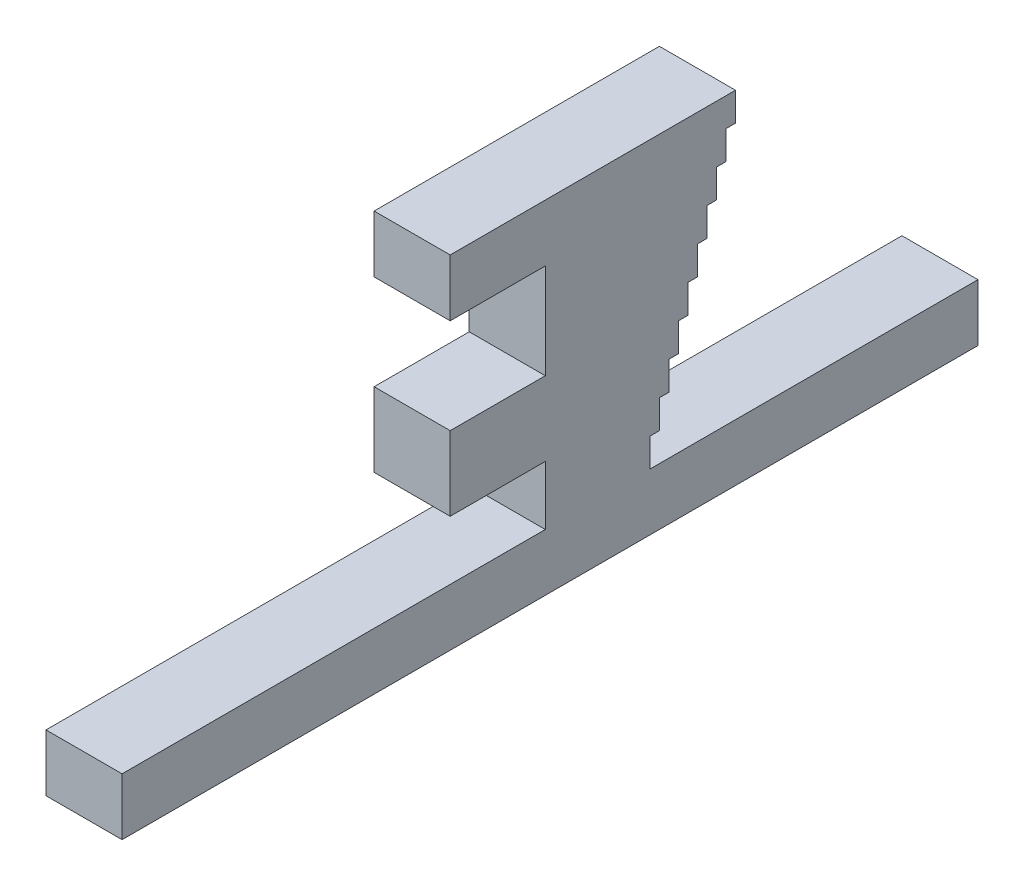
ISO-10303-21;
HEADER;
FILE_DESCRIPTION(('STEP AP214'),'2;1');
FILE_NAME('part.step','',(''),(''),'','','');
FILE_SCHEMA(('AUTOMOTIVE_DESIGN { 1 0 10303 214 1 1 1 1 }'));
ENDSEC;
DATA;
#1=APPLICATION_CONTEXT('core data for automotive mechanical design processes');
#2=APPLICATION_PROTOCOL_DEFINITION('international standard','automotive_design',2000,#1);
#3=PRODUCT_CONTEXT('',#1,'mechanical');
#4=PRODUCT('Part','Part','',(#3));
#5=PRODUCT_RELATED_PRODUCT_CATEGORY('part','',(#4));
#6=PRODUCT_DEFINITION_FORMATION('','',#4);
#7=PRODUCT_DEFINITION_CONTEXT('part definition',#1,'design');
#8=PRODUCT_DEFINITION('design','',#6,#7);
#9=PRODUCT_DEFINITION_SHAPE('','',#8);
#10=(LENGTH_UNIT() NAMED_UNIT(*) SI_UNIT(.MILLI.,.METRE.));
#11=(NAMED_UNIT(*) PLANE_ANGLE_UNIT() SI_UNIT($,.RADIAN.));
#12=(NAMED_UNIT(*) SI_UNIT($,.STERADIAN.) SOLID_ANGLE_UNIT());
#13=UNCERTAINTY_MEASURE_WITH_UNIT(LENGTH_MEASURE(1.E-05),#10,'distance_accuracy_value','');
#14=(GEOMETRIC_REPRESENTATION_CONTEXT(3) GLOBAL_UNCERTAINTY_ASSIGNED_CONTEXT((#13)) GLOBAL_UNIT_ASSIGNED_CONTEXT((#10,
#11,#12)) REPRESENTATION_CONTEXT('',''));
#15=CARTESIAN_POINT('',(0.,0.,0.));
#16=DIRECTION('',(0.,0.,1.));
#17=DIRECTION('',(1.,0.,0.));
#18=AXIS2_PLACEMENT_3D('',#15,#16,#17);
#19=CARTESIAN_POINT('',(4.,1.5,3.99999999999996));
#20=DIRECTION('',(0.,0.,1.));
#21=DIRECTION('',(0.,-1.,0.));
#22=AXIS2_PLACEMENT_3D('',#19,#20,#21);
#23=PLANE('',#22);
#24=DIRECTION('',(0.,1.,0.));
#25=VECTOR('',#24,1.);
#26=CARTESIAN_POINT('',(0.,1.5,3.99999999999996));
#27=LINE('',#26,#25);
#28=CARTESIAN_POINT('',(0.,0.,3.99999999999996));
#29=VERTEX_POINT('',#28);
#30=CARTESIAN_POINT('',(0.,1.5,3.99999999999996));
#31=VERTEX_POINT('',#30);
#32=EDGE_CURVE('E274',#29,#31,#27,.T.);
#33=ORIENTED_EDGE('',*,*,#32,.T.);
#34=DIRECTION('',(-1.,0.,0.));
#35=VECTOR('',#34,1.);
#36=CARTESIAN_POINT('',(4.,1.5,3.99999999999996));
#37=LINE('',#36,#35);
#38=CARTESIAN_POINT('',(4.,1.5,3.99999999999996));
#39=VERTEX_POINT('',#38);
#40=EDGE_CURVE('E11',#39,#31,#37,.T.);
#41=ORIENTED_EDGE('',*,*,#40,.F.);
#42=DIRECTION('',(0.,1.,0.));
#43=VECTOR('',#42,1.);
#44=CARTESIAN_POINT('',(4.,1.5,3.99999999999996));
#45=LINE('',#44,#43);
#46=CARTESIAN_POINT('',(4.,0.,3.99999999999996));
#47=VERTEX_POINT('',#46);
#48=EDGE_CURVE('E337',#47,#39,#45,.T.);
#49=ORIENTED_EDGE('',*,*,#48,.F.);
#50=DIRECTION('',(-1.,0.,0.));
#51=VECTOR('',#50,1.);
#52=CARTESIAN_POINT('',(4.,0.,3.99999999999996));
#53=LINE('',#52,#51);
#54=EDGE_CURVE('E270',#47,#29,#53,.T.);
#55=ORIENTED_EDGE('',*,*,#54,.T.);
#56=EDGE_LOOP('',(#33,#41,#49,#55));
#57=FACE_BOUND('',#56,.T.);
#58=ADVANCED_FACE('F34',(#57),#23,.F.);
#59=CARTESIAN_POINT('',(4.,1.5,3.49999999999996));
#60=DIRECTION('',(0.,1.,0.));
#61=DIRECTION('',(0.,0.,1.));
#62=AXIS2_PLACEMENT_3D('',#59,#60,#61);
#63=PLANE('',#62);
#64=DIRECTION('',(0.,0.,-1.));
#65=VECTOR('',#64,1.);
#66=CARTESIAN_POINT('',(0.,1.5,3.49999999999996));
#67=LINE('',#66,#65);
#68=CARTESIAN_POINT('',(0.,1.5,3.49999999999996));
#69=VERTEX_POINT('',#68);
#70=EDGE_CURVE('E277',#31,#69,#67,.T.);
#71=ORIENTED_EDGE('',*,*,#70,.T.);
#72=DIRECTION('',(-1.,0.,0.));
#73=VECTOR('',#72,1.);
#74=CARTESIAN_POINT('',(4.,1.5,3.49999999999996));
#75=LINE('',#74,#73);
#76=CARTESIAN_POINT('',(4.,1.5,3.49999999999996));
#77=VERTEX_POINT('',#76);
#78=EDGE_CURVE('E42',#77,#69,#75,.T.);
#79=ORIENTED_EDGE('',*,*,#78,.F.);
#80=DIRECTION('',(0.,0.,-1.));
#81=VECTOR('',#80,1.);
#82=CARTESIAN_POINT('',(4.,1.5,3.49999999999996));
#83=LINE('',#82,#81);
#84=EDGE_CURVE('E165',#39,#77,#83,.T.);
#85=ORIENTED_EDGE('',*,*,#84,.F.);
#86=ORIENTED_EDGE('',*,*,#40,.T.);
#87=EDGE_LOOP('',(#71,#79,#85,#86));
#88=FACE_BOUND('',#87,.T.);
#89=ADVANCED_FACE('F514',(#88),#63,.F.);
#90=CARTESIAN_POINT('',(4.,3.,3.49999999999995));
#91=DIRECTION('',(0.,0.,1.));
#92=DIRECTION('',(0.,-1.,0.));
#93=AXIS2_PLACEMENT_3D('',#90,#91,#92);
#94=PLANE('',#93);
#95=DIRECTION('',(0.,1.,0.));
#96=VECTOR('',#95,1.);
#97=CARTESIAN_POINT('',(0.,3.,3.49999999999995));
#98=LINE('',#97,#96);
#99=CARTESIAN_POINT('',(0.,3.,3.49999999999995));
#100=VERTEX_POINT('',#99);
#101=EDGE_CURVE('E279',#69,#100,#98,.T.);
#102=ORIENTED_EDGE('',*,*,#101,.T.);
#103=DIRECTION('',(-1.,0.,0.));
#104=VECTOR('',#103,1.);
#105=CARTESIAN_POINT('',(4.,3.,3.49999999999995));
#106=LINE('',#105,#104);
#107=CARTESIAN_POINT('',(4.,3.,3.49999999999995));
#108=VERTEX_POINT('',#107);
#109=EDGE_CURVE('E416',#108,#100,#106,.T.);
#110=ORIENTED_EDGE('',*,*,#109,.F.);
#111=DIRECTION('',(0.,1.,0.));
#112=VECTOR('',#111,1.);
#113=CARTESIAN_POINT('',(4.,3.,3.49999999999995));
#114=LINE('',#113,#112);
#115=EDGE_CURVE('E424',#77,#108,#114,.T.);
#116=ORIENTED_EDGE('',*,*,#115,.F.);
#117=ORIENTED_EDGE('',*,*,#78,.T.);
#118=EDGE_LOOP('',(#102,#110,#116,#117));
#119=FACE_BOUND('',#118,.T.);
#120=ADVANCED_FACE('F422',(#119),#94,.F.);
#121=CARTESIAN_POINT('',(4.,3.,2.99999999999996));
#122=DIRECTION('',(0.,1.,0.));
#123=DIRECTION('',(0.,0.,1.));
#124=AXIS2_PLACEMENT_3D('',#121,#122,#123);
#125=PLANE('',#124);
#126=DIRECTION('',(0.,0.,-1.));
#127=VECTOR('',#126,1.);
#128=CARTESIAN_POINT('',(0.,3.,2.99999999999996));
#129=LINE('',#128,#127);
#130=CARTESIAN_POINT('',(0.,3.,2.99999999999996));
#131=VERTEX_POINT('',#130);
#132=EDGE_CURVE('E281',#100,#131,#129,.T.);
#133=ORIENTED_EDGE('',*,*,#132,.T.);
#134=DIRECTION('',(-1.,0.,0.));
#135=VECTOR('',#134,1.);
#136=CARTESIAN_POINT('',(4.,3.,2.99999999999996));
#137=LINE('',#136,#135);
#138=CARTESIAN_POINT('',(4.,3.,2.99999999999996));
#139=VERTEX_POINT('',#138);
#140=EDGE_CURVE('E413',#139,#131,#137,.T.);
#141=ORIENTED_EDGE('',*,*,#140,.F.);
#142=DIRECTION('',(0.,0.,-1.));
#143=VECTOR('',#142,1.);
#144=CARTESIAN_POINT('',(4.,3.,2.99999999999996));
#145=LINE('',#144,#143);
#146=EDGE_CURVE('E442',#108,#139,#145,.T.);
#147=ORIENTED_EDGE('',*,*,#146,.F.);
#148=ORIENTED_EDGE('',*,*,#109,.T.);
#149=EDGE_LOOP('',(#133,#141,#147,#148));
#150=FACE_BOUND('',#149,.T.);
#151=ADVANCED_FACE('F433',(#150),#125,.F.);
#152=CARTESIAN_POINT('',(4.,4.5,2.99999999999996));
#153=DIRECTION('',(0.,0.,1.));
#154=DIRECTION('',(0.,-1.,0.));
#155=AXIS2_PLACEMENT_3D('',#152,#153,#154);
#156=PLANE('',#155);
#157=DIRECTION('',(0.,1.,0.));
#158=VECTOR('',#157,1.);
#159=CARTESIAN_POINT('',(0.,4.5,2.99999999999996));
#160=LINE('',#159,#158);
#161=CARTESIAN_POINT('',(0.,4.5,2.99999999999996));
#162=VERTEX_POINT('',#161);
#163=EDGE_CURVE('E283',#131,#162,#160,.T.);
#164=ORIENTED_EDGE('',*,*,#163,.T.);
#165=DIRECTION('',(-1.,0.,0.));
#166=VECTOR('',#165,1.);
#167=CARTESIAN_POINT('',(4.,4.5,2.99999999999996));
#168=LINE('',#167,#166);
#169=CARTESIAN_POINT('',(4.,4.5,2.99999999999996));
#170=VERTEX_POINT('',#169);
#171=EDGE_CURVE('E410',#170,#162,#168,.T.);
#172=ORIENTED_EDGE('',*,*,#171,.F.);
#173=DIRECTION('',(0.,1.,0.));
#174=VECTOR('',#173,1.);
#175=CARTESIAN_POINT('',(4.,4.5,2.99999999999996));
#176=LINE('',#175,#174);
#177=EDGE_CURVE('E439',#139,#170,#176,.T.);
#178=ORIENTED_EDGE('',*,*,#177,.F.);
#179=ORIENTED_EDGE('',*,*,#140,.T.);
#180=EDGE_LOOP('',(#164,#172,#178,#179));
#181=FACE_BOUND('',#180,.T.);
#182=ADVANCED_FACE('F437',(#181),#156,.F.);
#183=CARTESIAN_POINT('',(4.,4.5,2.49999999999998));
#184=DIRECTION('',(0.,1.,0.));
#185=DIRECTION('',(0.,0.,1.));
#186=AXIS2_PLACEMENT_3D('',#183,#184,#185);
#187=PLANE('',#186);
#188=DIRECTION('',(0.,0.,-1.));
#189=VECTOR('',#188,1.);
#190=CARTESIAN_POINT('',(0.,4.5,2.49999999999998));
#191=LINE('',#190,#189);
#192=CARTESIAN_POINT('',(0.,4.5,2.49999999999998));
#193=VERTEX_POINT('',#192);
#194=EDGE_CURVE('E285',#162,#193,#191,.T.);
#195=ORIENTED_EDGE('',*,*,#194,.T.);
#196=DIRECTION('',(-1.,0.,0.));
#197=VECTOR('',#196,1.);
#198=CARTESIAN_POINT('',(4.,4.5,2.49999999999998));
#199=LINE('',#198,#197);
#200=CARTESIAN_POINT('',(4.,4.5,2.49999999999998));
#201=VERTEX_POINT('',#200);
#202=EDGE_CURVE('E407',#201,#193,#199,.T.);
#203=ORIENTED_EDGE('',*,*,#202,.F.);
#204=DIRECTION('',(0.,0.,-1.));
#205=VECTOR('',#204,1.);
#206=CARTESIAN_POINT('',(4.,4.5,2.49999999999998));
#207=LINE('',#206,#205);
#208=EDGE_CURVE('E441',#170,#201,#207,.T.);
#209=ORIENTED_EDGE('',*,*,#208,.F.);
#210=ORIENTED_EDGE('',*,*,#171,.T.);
#211=EDGE_LOOP('',(#195,#203,#209,#210));
#212=FACE_BOUND('',#211,.T.);
#213=ADVANCED_FACE('F527',(#212),#187,.F.);
#214=CARTESIAN_POINT('',(4.,6.,2.49999999999998));
#215=DIRECTION('',(0.,0.,1.));
#216=DIRECTION('',(0.,-1.,0.));
#217=AXIS2_PLACEMENT_3D('',#214,#215,#216);
#218=PLANE('',#217);
#219=DIRECTION('',(0.,1.,0.));
#220=VECTOR('',#219,1.);
#221=CARTESIAN_POINT('',(0.,6.,2.49999999999998));
#222=LINE('',#221,#220);
#223=CARTESIAN_POINT('',(0.,6.,2.49999999999998));
#224=VERTEX_POINT('',#223);
#225=EDGE_CURVE('E287',#193,#224,#222,.T.);
#226=ORIENTED_EDGE('',*,*,#225,.T.);
#227=DIRECTION('',(-1.,0.,0.));
#228=VECTOR('',#227,1.);
#229=CARTESIAN_POINT('',(4.,6.,2.49999999999998));
#230=LINE('',#229,#228);
#231=CARTESIAN_POINT('',(4.,6.,2.49999999999998));
#232=VERTEX_POINT('',#231);
#233=EDGE_CURVE('E404',#232,#224,#230,.T.);
#234=ORIENTED_EDGE('',*,*,#233,.F.);
#235=DIRECTION('',(0.,1.,0.));
#236=VECTOR('',#235,1.);
#237=CARTESIAN_POINT('',(4.,6.,2.49999999999998));
#238=LINE('',#237,#236);
#239=EDGE_CURVE('E444',#201,#232,#238,.T.);
#240=ORIENTED_EDGE('',*,*,#239,.F.);
#241=ORIENTED_EDGE('',*,*,#202,.T.);
#242=EDGE_LOOP('',(#226,#234,#240,#241));
#243=FACE_BOUND('',#242,.T.);
#244=ADVANCED_FACE('F530',(#243),#218,.F.);
#245=CARTESIAN_POINT('',(4.,6.,1.99999999999999));
#246=DIRECTION('',(0.,1.,0.));
#247=DIRECTION('',(0.,0.,1.));
#248=AXIS2_PLACEMENT_3D('',#245,#246,#247);
#249=PLANE('',#248);
#250=DIRECTION('',(0.,0.,-1.));
#251=VECTOR('',#250,1.);
#252=CARTESIAN_POINT('',(0.,6.,1.99999999999999));
#253=LINE('',#252,#251);
#254=CARTESIAN_POINT('',(0.,6.,1.99999999999999));
#255=VERTEX_POINT('',#254);
#256=EDGE_CURVE('E289',#224,#255,#253,.T.);
#257=ORIENTED_EDGE('',*,*,#256,.T.);
#258=DIRECTION('',(-1.,0.,0.));
#259=VECTOR('',#258,1.);
#260=CARTESIAN_POINT('',(4.,6.,1.99999999999999));
#261=LINE('',#260,#259);
#262=CARTESIAN_POINT('',(4.,6.,1.99999999999999));
#263=VERTEX_POINT('',#262);
#264=EDGE_CURVE('E401',#263,#255,#261,.T.);
#265=ORIENTED_EDGE('',*,*,#264,.F.);
#266=DIRECTION('',(0.,0.,-1.));
#267=VECTOR('',#266,1.);
#268=CARTESIAN_POINT('',(4.,6.,1.99999999999999));
#269=LINE('',#268,#267);
#270=EDGE_CURVE('E450',#232,#263,#269,.T.);
#271=ORIENTED_EDGE('',*,*,#270,.F.);
#272=ORIENTED_EDGE('',*,*,#233,.T.);
#273=EDGE_LOOP('',(#257,#265,#271,#272));
#274=FACE_BOUND('',#273,.T.);
#275=ADVANCED_FACE('F534',(#274),#249,.F.);
#276=CARTESIAN_POINT('',(4.,7.5,1.99999999999998));
#277=DIRECTION('',(0.,0.,1.));
#278=DIRECTION('',(0.,-1.,0.));
#279=AXIS2_PLACEMENT_3D('',#276,#277,#278);
#280=PLANE('',#279);
#281=DIRECTION('',(0.,1.,0.));
#282=VECTOR('',#281,1.);
#283=CARTESIAN_POINT('',(0.,7.5,1.99999999999998));
#284=LINE('',#283,#282);
#285=CARTESIAN_POINT('',(0.,7.5,1.99999999999998));
#286=VERTEX_POINT('',#285);
#287=EDGE_CURVE('E291',#255,#286,#284,.T.);
#288=ORIENTED_EDGE('',*,*,#287,.T.);
#289=DIRECTION('',(-1.,0.,0.));
#290=VECTOR('',#289,1.);
#291=CARTESIAN_POINT('',(4.,7.5,1.99999999999998));
#292=LINE('',#291,#290);
#293=CARTESIAN_POINT('',(4.,7.5,1.99999999999998));
#294=VERTEX_POINT('',#293);
#295=EDGE_CURVE('E398',#294,#286,#292,.T.);
#296=ORIENTED_EDGE('',*,*,#295,.F.);
#297=DIRECTION('',(0.,1.,0.));
#298=VECTOR('',#297,1.);
#299=CARTESIAN_POINT('',(4.,7.5,1.99999999999998));
#300=LINE('',#299,#298);
#301=EDGE_CURVE('E452',#263,#294,#300,.T.);
#302=ORIENTED_EDGE('',*,*,#301,.F.);
#303=ORIENTED_EDGE('',*,*,#264,.T.);
#304=EDGE_LOOP('',(#288,#296,#302,#303));
#305=FACE_BOUND('',#304,.T.);
#306=ADVANCED_FACE('F538',(#305),#280,.F.);
#307=CARTESIAN_POINT('',(4.,7.5,1.49999999999998));
#308=DIRECTION('',(0.,1.,0.));
#309=DIRECTION('',(0.,0.,1.));
#310=AXIS2_PLACEMENT_3D('',#307,#308,#309);
#311=PLANE('',#310);
#312=DIRECTION('',(0.,0.,-1.));
#313=VECTOR('',#312,1.);
#314=CARTESIAN_POINT('',(0.,7.5,1.49999999999998));
#315=LINE('',#314,#313);
#316=CARTESIAN_POINT('',(0.,7.5,1.49999999999998));
#317=VERTEX_POINT('',#316);
#318=EDGE_CURVE('E293',#286,#317,#315,.T.);
#319=ORIENTED_EDGE('',*,*,#318,.T.);
#320=DIRECTION('',(-1.,0.,0.));
#321=VECTOR('',#320,1.);
#322=CARTESIAN_POINT('',(4.,7.5,1.49999999999998));
#323=LINE('',#322,#321);
#324=CARTESIAN_POINT('',(4.,7.5,1.49999999999998));
#325=VERTEX_POINT('',#324);
#326=EDGE_CURVE('E395',#325,#317,#323,.T.);
#327=ORIENTED_EDGE('',*,*,#326,.F.);
#328=DIRECTION('',(0.,0.,-1.));
#329=VECTOR('',#328,1.);
#330=CARTESIAN_POINT('',(4.,7.5,1.49999999999998));
#331=LINE('',#330,#329);
#332=EDGE_CURVE('E454',#294,#325,#331,.T.);
#333=ORIENTED_EDGE('',*,*,#332,.F.);
#334=ORIENTED_EDGE('',*,*,#295,.T.);
#335=EDGE_LOOP('',(#319,#327,#333,#334));
#336=FACE_BOUND('',#335,.T.);
#337=ADVANCED_FACE('F542',(#336),#311,.F.);
#338=CARTESIAN_POINT('',(4.,9.,1.49999999999999));
#339=DIRECTION('',(0.,0.,1.));
#340=DIRECTION('',(0.,-1.,0.));
#341=AXIS2_PLACEMENT_3D('',#338,#339,#340);
#342=PLANE('',#341);
#343=DIRECTION('',(0.,1.,0.));
#344=VECTOR('',#343,1.);
#345=CARTESIAN_POINT('',(0.,9.,1.49999999999999));
#346=LINE('',#345,#344);
#347=CARTESIAN_POINT('',(0.,9.,1.49999999999999));
#348=VERTEX_POINT('',#347);
#349=EDGE_CURVE('E295',#317,#348,#346,.T.);
#350=ORIENTED_EDGE('',*,*,#349,.T.);
#351=DIRECTION('',(-1.,0.,0.));
#352=VECTOR('',#351,1.);
#353=CARTESIAN_POINT('',(4.,9.,1.49999999999999));
#354=LINE('',#353,#352);
#355=CARTESIAN_POINT('',(4.,9.,1.49999999999999));
#356=VERTEX_POINT('',#355);
#357=EDGE_CURVE('E392',#356,#348,#354,.T.);
#358=ORIENTED_EDGE('',*,*,#357,.F.);
#359=DIRECTION('',(0.,1.,0.));
#360=VECTOR('',#359,1.);
#361=CARTESIAN_POINT('',(4.,9.,1.49999999999999));
#362=LINE('',#361,#360);
#363=EDGE_CURVE('E456',#325,#356,#362,.T.);
#364=ORIENTED_EDGE('',*,*,#363,.F.);
#365=ORIENTED_EDGE('',*,*,#326,.T.);
#366=EDGE_LOOP('',(#350,#358,#364,#365));
#367=FACE_BOUND('',#366,.T.);
#368=ADVANCED_FACE('F546',(#367),#342,.F.);
#369=CARTESIAN_POINT('',(4.,9.,0.999999999999981));
#370=DIRECTION('',(0.,1.,0.));
#371=DIRECTION('',(0.,0.,1.));
#372=AXIS2_PLACEMENT_3D('',#369,#370,#371);
#373=PLANE('',#372);
#374=DIRECTION('',(0.,0.,-1.));
#375=VECTOR('',#374,1.);
#376=CARTESIAN_POINT('',(0.,9.,0.999999999999981));
#377=LINE('',#376,#375);
#378=CARTESIAN_POINT('',(0.,9.,0.999999999999981));
#379=VERTEX_POINT('',#378);
#380=EDGE_CURVE('E297',#348,#379,#377,.T.);
#381=ORIENTED_EDGE('',*,*,#380,.T.);
#382=DIRECTION('',(-1.,0.,0.));
#383=VECTOR('',#382,1.);
#384=CARTESIAN_POINT('',(4.,9.,0.999999999999981));
#385=LINE('',#384,#383);
#386=CARTESIAN_POINT('',(4.,9.,0.999999999999981));
#387=VERTEX_POINT('',#386);
#388=EDGE_CURVE('E389',#387,#379,#385,.T.);
#389=ORIENTED_EDGE('',*,*,#388,.F.);
#390=DIRECTION('',(0.,0.,-1.));
#391=VECTOR('',#390,1.);
#392=CARTESIAN_POINT('',(4.,9.,0.999999999999981));
#393=LINE('',#392,#391);
#394=EDGE_CURVE('E458',#356,#387,#393,.T.);
#395=ORIENTED_EDGE('',*,*,#394,.F.);
#396=ORIENTED_EDGE('',*,*,#357,.T.);
#397=EDGE_LOOP('',(#381,#389,#395,#396));
#398=FACE_BOUND('',#397,.T.);
#399=ADVANCED_FACE('F550',(#398),#373,.F.);
#400=CARTESIAN_POINT('',(4.,10.5,0.999999999999996));
#401=DIRECTION('',(0.,0.,1.));
#402=DIRECTION('',(0.,-1.,0.));
#403=AXIS2_PLACEMENT_3D('',#400,#401,#402);
#404=PLANE('',#403);
#405=DIRECTION('',(0.,1.,0.));
#406=VECTOR('',#405,1.);
#407=CARTESIAN_POINT('',(0.,10.5,0.999999999999996));
#408=LINE('',#407,#406);
#409=CARTESIAN_POINT('',(0.,10.5,0.999999999999996));
#410=VERTEX_POINT('',#409);
#411=EDGE_CURVE('E299',#379,#410,#408,.T.);
#412=ORIENTED_EDGE('',*,*,#411,.T.);
#413=DIRECTION('',(-1.,0.,0.));
#414=VECTOR('',#413,1.);
#415=CARTESIAN_POINT('',(4.,10.5,0.999999999999996));
#416=LINE('',#415,#414);
#417=CARTESIAN_POINT('',(4.,10.5,0.999999999999996));
#418=VERTEX_POINT('',#417);
#419=EDGE_CURVE('E386',#418,#410,#416,.T.);
#420=ORIENTED_EDGE('',*,*,#419,.F.);
#421=DIRECTION('',(0.,1.,0.));
#422=VECTOR('',#421,1.);
#423=CARTESIAN_POINT('',(4.,10.5,0.999999999999996));
#424=LINE('',#423,#422);
#425=EDGE_CURVE('E460',#387,#418,#424,.T.);
#426=ORIENTED_EDGE('',*,*,#425,.F.);
#427=ORIENTED_EDGE('',*,*,#388,.T.);
#428=EDGE_LOOP('',(#412,#420,#426,#427));
#429=FACE_BOUND('',#428,.T.);
#430=ADVANCED_FACE('F554',(#429),#404,.F.);
#431=CARTESIAN_POINT('',(4.,10.5,0.499999999999994));
#432=DIRECTION('',(0.,1.,0.));
#433=DIRECTION('',(0.,0.,1.));
#434=AXIS2_PLACEMENT_3D('',#431,#432,#433);
#435=PLANE('',#434);
#436=DIRECTION('',(0.,0.,-1.));
#437=VECTOR('',#436,1.);
#438=CARTESIAN_POINT('',(0.,10.5,0.499999999999994));
#439=LINE('',#438,#437);
#440=CARTESIAN_POINT('',(0.,10.5,0.499999999999994));
#441=VERTEX_POINT('',#440);
#442=EDGE_CURVE('E301',#410,#441,#439,.T.);
#443=ORIENTED_EDGE('',*,*,#442,.T.);
#444=DIRECTION('',(-1.,0.,0.));
#445=VECTOR('',#444,1.);
#446=CARTESIAN_POINT('',(4.,10.5,0.499999999999994));
#447=LINE('',#446,#445);
#448=CARTESIAN_POINT('',(4.,10.5,0.499999999999994));
#449=VERTEX_POINT('',#448);
#450=EDGE_CURVE('E383',#449,#441,#447,.T.);
#451=ORIENTED_EDGE('',*,*,#450,.F.);
#452=DIRECTION('',(0.,0.,-1.));
#453=VECTOR('',#452,1.);
#454=CARTESIAN_POINT('',(4.,10.5,0.499999999999994));
#455=LINE('',#454,#453);
#456=EDGE_CURVE('E462',#418,#449,#455,.T.);
#457=ORIENTED_EDGE('',*,*,#456,.F.);
#458=ORIENTED_EDGE('',*,*,#419,.T.);
#459=EDGE_LOOP('',(#443,#451,#457,#458));
#460=FACE_BOUND('',#459,.T.);
#461=ADVANCED_FACE('F558',(#460),#435,.F.);
#462=CARTESIAN_POINT('',(4.,12.,0.5));
#463=DIRECTION('',(0.,0.,1.));
#464=DIRECTION('',(0.,-1.,0.));
#465=AXIS2_PLACEMENT_3D('',#462,#463,#464);
#466=PLANE('',#465);
#467=DIRECTION('',(0.,1.,0.));
#468=VECTOR('',#467,1.);
#469=CARTESIAN_POINT('',(0.,12.,0.5));
#470=LINE('',#469,#468);
#471=CARTESIAN_POINT('',(0.,12.,0.5));
#472=VERTEX_POINT('',#471);
#473=EDGE_CURVE('E303',#441,#472,#470,.T.);
#474=ORIENTED_EDGE('',*,*,#473,.T.);
#475=DIRECTION('',(-1.,0.,0.));
#476=VECTOR('',#475,1.);
#477=CARTESIAN_POINT('',(4.,12.,0.5));
#478=LINE('',#477,#476);
#479=CARTESIAN_POINT('',(4.,12.,0.5));
#480=VERTEX_POINT('',#479);
#481=EDGE_CURVE('E380',#480,#472,#478,.T.);
#482=ORIENTED_EDGE('',*,*,#481,.F.);
#483=DIRECTION('',(0.,1.,0.));
#484=VECTOR('',#483,1.);
#485=CARTESIAN_POINT('',(4.,12.,0.5));
#486=LINE('',#485,#484);
#487=EDGE_CURVE('E464',#449,#480,#486,.T.);
#488=ORIENTED_EDGE('',*,*,#487,.F.);
#489=ORIENTED_EDGE('',*,*,#450,.T.);
#490=EDGE_LOOP('',(#474,#482,#488,#489));
#491=FACE_BOUND('',#490,.T.);
#492=ADVANCED_FACE('F562',(#491),#466,.F.);
#493=CARTESIAN_POINT('',(4.,12.,0.));
#494=DIRECTION('',(0.,1.,0.));
#495=DIRECTION('',(0.,0.,1.));
#496=AXIS2_PLACEMENT_3D('',#493,#494,#495);
#497=PLANE('',#496);
#498=DIRECTION('',(0.,0.,-1.));
#499=VECTOR('',#498,1.);
#500=CARTESIAN_POINT('',(0.,12.,0.));
#501=LINE('',#500,#499);
#502=CARTESIAN_POINT('',(0.,12.,0.));
#503=VERTEX_POINT('',#502);
#504=EDGE_CURVE('E305',#472,#503,#501,.T.);
#505=ORIENTED_EDGE('',*,*,#504,.T.);
#506=DIRECTION('',(-1.,0.,0.));
#507=VECTOR('',#506,1.);
#508=CARTESIAN_POINT('',(4.,12.,0.));
#509=LINE('',#508,#507);
#510=CARTESIAN_POINT('',(4.,12.,0.));
#511=VERTEX_POINT('',#510);
#512=EDGE_CURVE('E377',#511,#503,#509,.T.);
#513=ORIENTED_EDGE('',*,*,#512,.F.);
#514=DIRECTION('',(0.,0.,-1.));
#515=VECTOR('',#514,1.);
#516=CARTESIAN_POINT('',(4.,12.,0.));
#517=LINE('',#516,#515);
#518=EDGE_CURVE('E466',#480,#511,#517,.T.);
#519=ORIENTED_EDGE('',*,*,#518,.F.);
#520=ORIENTED_EDGE('',*,*,#481,.T.);
#521=EDGE_LOOP('',(#505,#513,#519,#520));
#522=FACE_BOUND('',#521,.T.);
#523=ADVANCED_FACE('F566',(#522),#497,.F.);
#524=CARTESIAN_POINT('',(4.,13.5,0.));
#525=DIRECTION('',(0.,0.,1.));
#526=DIRECTION('',(1.,0.,0.));
#527=AXIS2_PLACEMENT_3D('',#524,#525,#526);
#528=PLANE('',#527);
#529=DIRECTION('',(0.,1.,0.));
#530=VECTOR('',#529,1.);
#531=CARTESIAN_POINT('',(0.,13.5,0.));
#532=LINE('',#531,#530);
#533=CARTESIAN_POINT('',(0.,13.5,0.));
#534=VERTEX_POINT('',#533);
#535=EDGE_CURVE('E307',#503,#534,#532,.T.);
#536=ORIENTED_EDGE('',*,*,#535,.T.);
#537=DIRECTION('',(-1.,0.,0.));
#538=VECTOR('',#537,1.);
#539=CARTESIAN_POINT('',(4.,13.5,0.));
#540=LINE('',#539,#538);
#541=CARTESIAN_POINT('',(4.,13.5,0.));
#542=VERTEX_POINT('',#541);
#543=EDGE_CURVE('E374',#542,#534,#540,.T.);
#544=ORIENTED_EDGE('',*,*,#543,.F.);
#545=DIRECTION('',(0.,1.,0.));
#546=VECTOR('',#545,1.);
#547=CARTESIAN_POINT('',(4.,13.5,0.));
#548=LINE('',#547,#546);
#549=EDGE_CURVE('E468',#511,#542,#548,.T.);
#550=ORIENTED_EDGE('',*,*,#549,.F.);
#551=ORIENTED_EDGE('',*,*,#512,.T.);
#552=EDGE_LOOP('',(#536,#544,#550,#551));
#553=FACE_BOUND('',#552,.T.);
#554=ADVANCED_FACE('F570',(#553),#528,.F.);
#555=CARTESIAN_POINT('',(4.,13.5,-0.500000000000043));
#556=DIRECTION('',(0.,1.,0.));
#557=DIRECTION('',(0.,0.,1.));
#558=AXIS2_PLACEMENT_3D('',#555,#556,#557);
#559=PLANE('',#558);
#560=DIRECTION('',(0.,0.,-1.));
#561=VECTOR('',#560,1.);
#562=CARTESIAN_POINT('',(0.,13.5,-0.500000000000043));
#563=LINE('',#562,#561);
#564=CARTESIAN_POINT('',(0.,13.5,-0.500000000000043));
#565=VERTEX_POINT('',#564);
#566=EDGE_CURVE('E309',#534,#565,#563,.T.);
#567=ORIENTED_EDGE('',*,*,#566,.T.);
#568=DIRECTION('',(-1.,0.,0.));
#569=VECTOR('',#568,1.);
#570=CARTESIAN_POINT('',(4.,13.5,-0.500000000000043));
#571=LINE('',#570,#569);
#572=CARTESIAN_POINT('',(4.,13.5,-0.500000000000043));
#573=VERTEX_POINT('',#572);
#574=EDGE_CURVE('E371',#573,#565,#571,.T.);
#575=ORIENTED_EDGE('',*,*,#574,.F.);
#576=DIRECTION('',(0.,0.,-1.));
#577=VECTOR('',#576,1.);
#578=CARTESIAN_POINT('',(4.,13.5,-0.500000000000043));
#579=LINE('',#578,#577);
#580=EDGE_CURVE('E470',#542,#573,#579,.T.);
#581=ORIENTED_EDGE('',*,*,#580,.F.);
#582=ORIENTED_EDGE('',*,*,#543,.T.);
#583=EDGE_LOOP('',(#567,#575,#581,#582));
#584=FACE_BOUND('',#583,.T.);
#585=ADVANCED_FACE('F574',(#584),#559,.F.);
#586=CARTESIAN_POINT('',(4.,15.,-0.499999999999998));
#587=DIRECTION('',(0.,0.,1.));
#588=DIRECTION('',(0.,-1.,0.));
#589=AXIS2_PLACEMENT_3D('',#586,#587,#588);
#590=PLANE('',#589);
#591=DIRECTION('',(0.,1.,0.));
#592=VECTOR('',#591,1.);
#593=CARTESIAN_POINT('',(0.,15.,-0.499999999999998));
#594=LINE('',#593,#592);
#595=CARTESIAN_POINT('',(0.,15.,-0.499999999999998));
#596=VERTEX_POINT('',#595);
#597=EDGE_CURVE('E311',#565,#596,#594,.T.);
#598=ORIENTED_EDGE('',*,*,#597,.T.);
#599=DIRECTION('',(-1.,0.,0.));
#600=VECTOR('',#599,1.);
#601=CARTESIAN_POINT('',(4.,15.,-0.499999999999998));
#602=LINE('',#601,#600);
#603=CARTESIAN_POINT('',(4.,15.,-0.499999999999998));
#604=VERTEX_POINT('',#603);
#605=EDGE_CURVE('E368',#604,#596,#602,.T.);
#606=ORIENTED_EDGE('',*,*,#605,.F.);
#607=DIRECTION('',(0.,1.,0.));
#608=VECTOR('',#607,1.);
#609=CARTESIAN_POINT('',(4.,15.,-0.499999999999998));
#610=LINE('',#609,#608);
#611=EDGE_CURVE('E472',#573,#604,#610,.T.);
#612=ORIENTED_EDGE('',*,*,#611,.F.);
#613=ORIENTED_EDGE('',*,*,#574,.T.);
#614=EDGE_LOOP('',(#598,#606,#612,#613));
#615=FACE_BOUND('',#614,.T.);
#616=ADVANCED_FACE('F578',(#615),#590,.F.);
#617=CARTESIAN_POINT('',(4.,15.,14.5));
#618=DIRECTION('',(0.,-1.,0.));
#619=DIRECTION('',(0.,0.,-1.));
#620=AXIS2_PLACEMENT_3D('',#617,#618,#619);
#621=PLANE('',#620);
#622=DIRECTION('',(0.,0.,1.));
#623=VECTOR('',#622,1.);
#624=CARTESIAN_POINT('',(0.,15.,14.5));
#625=LINE('',#624,#623);
#626=CARTESIAN_POINT('',(0.,15.,14.5));
#627=VERTEX_POINT('',#626);
#628=EDGE_CURVE('E313',#596,#627,#625,.T.);
#629=ORIENTED_EDGE('',*,*,#628,.T.);
#630=DIRECTION('',(-1.,0.,0.));
#631=VECTOR('',#630,1.);
#632=CARTESIAN_POINT('',(4.,15.,14.5));
#633=LINE('',#632,#631);
#634=CARTESIAN_POINT('',(4.,15.,14.5));
#635=VERTEX_POINT('',#634);
#636=EDGE_CURVE('E365',#635,#627,#633,.T.);
#637=ORIENTED_EDGE('',*,*,#636,.F.);
#638=DIRECTION('',(0.,0.,1.));
#639=VECTOR('',#638,1.);
#640=CARTESIAN_POINT('',(4.,15.,14.5));
#641=LINE('',#640,#639);
#642=EDGE_CURVE('E474',#604,#635,#641,.T.);
#643=ORIENTED_EDGE('',*,*,#642,.F.);
#644=ORIENTED_EDGE('',*,*,#605,.T.);
#645=EDGE_LOOP('',(#629,#637,#643,#644));
#646=FACE_BOUND('',#645,.T.);
#647=ADVANCED_FACE('F582',(#646),#621,.F.);
#648=CARTESIAN_POINT('',(4.,15.,14.5));
#649=DIRECTION('',(0.,0.,-1.));
#650=DIRECTION('',(-1.,0.,0.));
#651=AXIS2_PLACEMENT_3D('',#648,#649,#650);
#652=PLANE('',#651);
#653=DIRECTION('',(0.,-1.,0.));
#654=VECTOR('',#653,1.);
#655=CARTESIAN_POINT('',(0.,15.,14.5));
#656=LINE('',#655,#654);
#657=CARTESIAN_POINT('',(0.,12.,14.5));
#658=VERTEX_POINT('',#657);
#659=EDGE_CURVE('E315',#627,#658,#656,.T.);
#660=ORIENTED_EDGE('',*,*,#659,.T.);
#661=DIRECTION('',(-1.,0.,0.));
#662=VECTOR('',#661,1.);
#663=CARTESIAN_POINT('',(4.,12.,14.5));
#664=LINE('',#663,#662);
#665=CARTESIAN_POINT('',(4.,12.,14.5));
#666=VERTEX_POINT('',#665);
#667=EDGE_CURVE('E362',#666,#658,#664,.T.);
#668=ORIENTED_EDGE('',*,*,#667,.F.);
#669=DIRECTION('',(0.,-1.,0.));
#670=VECTOR('',#669,1.);
#671=CARTESIAN_POINT('',(4.,15.,14.5));
#672=LINE('',#671,#670);
#673=EDGE_CURVE('E476',#635,#666,#672,.T.);
#674=ORIENTED_EDGE('',*,*,#673,.F.);
#675=ORIENTED_EDGE('',*,*,#636,.T.);
#676=EDGE_LOOP('',(#660,#668,#674,#675));
#677=FACE_BOUND('',#676,.T.);
#678=ADVANCED_FACE('F586',(#677),#652,.F.);
#679=CARTESIAN_POINT('',(4.,12.,9.49999999999997));
#680=DIRECTION('',(0.,1.,0.));
#681=DIRECTION('',(0.,0.,1.));
#682=AXIS2_PLACEMENT_3D('',#679,#680,#681);
#683=PLANE('',#682);
#684=DIRECTION('',(0.,0.,-1.));
#685=VECTOR('',#684,1.);
#686=CARTESIAN_POINT('',(0.,12.,9.49999999999997));
#687=LINE('',#686,#685);
#688=CARTESIAN_POINT('',(0.,12.,9.49999999999997));
#689=VERTEX_POINT('',#688);
#690=EDGE_CURVE('E317',#658,#689,#687,.T.);
#691=ORIENTED_EDGE('',*,*,#690,.T.);
#692=DIRECTION('',(-1.,0.,0.));
#693=VECTOR('',#692,1.);
#694=CARTESIAN_POINT('',(4.,12.,9.49999999999997));
#695=LINE('',#694,#693);
#696=CARTESIAN_POINT('',(4.,12.,9.49999999999997));
#697=VERTEX_POINT('',#696);
#698=EDGE_CURVE('E359',#697,#689,#695,.T.);
#699=ORIENTED_EDGE('',*,*,#698,.F.);
#700=DIRECTION('',(0.,0.,-1.));
#701=VECTOR('',#700,1.);
#702=CARTESIAN_POINT('',(4.,12.,9.49999999999997));
#703=LINE('',#702,#701);
#704=EDGE_CURVE('E478',#666,#697,#703,.T.);
#705=ORIENTED_EDGE('',*,*,#704,.F.);
#706=ORIENTED_EDGE('',*,*,#667,.T.);
#707=EDGE_LOOP('',(#691,#699,#705,#706));
#708=FACE_BOUND('',#707,.T.);
#709=ADVANCED_FACE('F590',(#708),#683,.F.);
#710=CARTESIAN_POINT('',(4.,12.,9.49999999999997));
#711=DIRECTION('',(0.,0.,-1.));
#712=DIRECTION('',(0.,1.,0.));
#713=AXIS2_PLACEMENT_3D('',#710,#711,#712);
#714=PLANE('',#713);
#715=DIRECTION('',(0.,-1.,0.));
#716=VECTOR('',#715,1.);
#717=CARTESIAN_POINT('',(0.,12.,9.49999999999997));
#718=LINE('',#717,#716);
#719=CARTESIAN_POINT('',(0.,7.,9.49999999999998));
#720=VERTEX_POINT('',#719);
#721=EDGE_CURVE('E319',#689,#720,#718,.T.);
#722=ORIENTED_EDGE('',*,*,#721,.T.);
#723=DIRECTION('',(-1.,0.,0.));
#724=VECTOR('',#723,1.);
#725=CARTESIAN_POINT('',(4.,7.,9.49999999999998));
#726=LINE('',#725,#724);
#727=CARTESIAN_POINT('',(4.,7.,9.49999999999998));
#728=VERTEX_POINT('',#727);
#729=EDGE_CURVE('E356',#728,#720,#726,.T.);
#730=ORIENTED_EDGE('',*,*,#729,.F.);
#731=DIRECTION('',(0.,-1.,0.));
#732=VECTOR('',#731,1.);
#733=CARTESIAN_POINT('',(4.,12.,9.49999999999997));
#734=LINE('',#733,#732);
#735=EDGE_CURVE('E480',#697,#728,#734,.T.);
#736=ORIENTED_EDGE('',*,*,#735,.F.);
#737=ORIENTED_EDGE('',*,*,#698,.T.);
#738=EDGE_LOOP('',(#722,#730,#736,#737));
#739=FACE_BOUND('',#738,.T.);
#740=ADVANCED_FACE('F594',(#739),#714,.F.);
#741=CARTESIAN_POINT('',(4.,7.,9.49999999999998));
#742=DIRECTION('',(0.,-1.,0.));
#743=DIRECTION('',(0.,0.,-1.));
#744=AXIS2_PLACEMENT_3D('',#741,#742,#743);
#745=PLANE('',#744);
#746=DIRECTION('',(0.,0.,1.));
#747=VECTOR('',#746,1.);
#748=CARTESIAN_POINT('',(0.,7.,9.49999999999998));
#749=LINE('',#748,#747);
#750=CARTESIAN_POINT('',(0.,7.,14.5));
#751=VERTEX_POINT('',#750);
#752=EDGE_CURVE('E321',#720,#751,#749,.T.);
#753=ORIENTED_EDGE('',*,*,#752,.T.);
#754=DIRECTION('',(-1.,0.,0.));
#755=VECTOR('',#754,1.);
#756=CARTESIAN_POINT('',(4.,7.,14.5));
#757=LINE('',#756,#755);
#758=CARTESIAN_POINT('',(4.,7.,14.5));
#759=VERTEX_POINT('',#758);
#760=EDGE_CURVE('E353',#759,#751,#757,.T.);
#761=ORIENTED_EDGE('',*,*,#760,.F.);
#762=DIRECTION('',(0.,0.,1.));
#763=VECTOR('',#762,1.);
#764=CARTESIAN_POINT('',(4.,7.,9.49999999999998));
#765=LINE('',#764,#763);
#766=EDGE_CURVE('E482',#728,#759,#765,.T.);
#767=ORIENTED_EDGE('',*,*,#766,.F.);
#768=ORIENTED_EDGE('',*,*,#729,.T.);
#769=EDGE_LOOP('',(#753,#761,#767,#768));
#770=FACE_BOUND('',#769,.T.);
#771=ADVANCED_FACE('F598',(#770),#745,.F.);
#772=CARTESIAN_POINT('',(4.,7.,14.5));
#773=DIRECTION('',(0.,0.,-1.));
#774=DIRECTION('',(-1.,0.,0.));
#775=AXIS2_PLACEMENT_3D('',#772,#773,#774);
#776=PLANE('',#775);
#777=DIRECTION('',(0.,-1.,0.));
#778=VECTOR('',#777,1.);
#779=CARTESIAN_POINT('',(0.,7.,14.5));
#780=LINE('',#779,#778);
#781=CARTESIAN_POINT('',(0.,3.1,14.5));
#782=VERTEX_POINT('',#781);
#783=EDGE_CURVE('E323',#751,#782,#780,.T.);
#784=ORIENTED_EDGE('',*,*,#783,.T.);
#785=DIRECTION('',(-1.,0.,0.));
#786=VECTOR('',#785,1.);
#787=CARTESIAN_POINT('',(4.,3.1,14.5));
#788=LINE('',#787,#786);
#789=CARTESIAN_POINT('',(4.,3.1,14.5));
#790=VERTEX_POINT('',#789);
#791=EDGE_CURVE('E350',#790,#782,#788,.T.);
#792=ORIENTED_EDGE('',*,*,#791,.F.);
#793=DIRECTION('',(0.,-1.,0.));
#794=VECTOR('',#793,1.);
#795=CARTESIAN_POINT('',(4.,7.,14.5));
#796=LINE('',#795,#794);
#797=EDGE_CURVE('E484',#759,#790,#796,.T.);
#798=ORIENTED_EDGE('',*,*,#797,.F.);
#799=ORIENTED_EDGE('',*,*,#760,.T.);
#800=EDGE_LOOP('',(#784,#792,#798,#799));
#801=FACE_BOUND('',#800,.T.);
#802=ADVANCED_FACE('F602',(#801),#776,.F.);
#803=CARTESIAN_POINT('',(4.,3.1,9.49999999999998));
#804=DIRECTION('',(0.,1.,0.));
#805=DIRECTION('',(0.,0.,1.));
#806=AXIS2_PLACEMENT_3D('',#803,#804,#805);
#807=PLANE('',#806);
#808=DIRECTION('',(0.,0.,-1.));
#809=VECTOR('',#808,1.);
#810=CARTESIAN_POINT('',(0.,3.1,9.49999999999998));
#811=LINE('',#810,#809);
#812=CARTESIAN_POINT('',(0.,3.1,9.49999999999998));
#813=VERTEX_POINT('',#812);
#814=EDGE_CURVE('E325',#782,#813,#811,.T.);
#815=ORIENTED_EDGE('',*,*,#814,.T.);
#816=DIRECTION('',(-1.,0.,0.));
#817=VECTOR('',#816,1.);
#818=CARTESIAN_POINT('',(4.,3.1,9.49999999999998));
#819=LINE('',#818,#817);
#820=CARTESIAN_POINT('',(4.,3.1,9.49999999999998));
#821=VERTEX_POINT('',#820);
#822=EDGE_CURVE('E347',#821,#813,#819,.T.);
#823=ORIENTED_EDGE('',*,*,#822,.F.);
#824=DIRECTION('',(0.,0.,-1.));
#825=VECTOR('',#824,1.);
#826=CARTESIAN_POINT('',(4.,3.1,9.49999999999998));
#827=LINE('',#826,#825);
#828=EDGE_CURVE('E486',#790,#821,#827,.T.);
#829=ORIENTED_EDGE('',*,*,#828,.F.);
#830=ORIENTED_EDGE('',*,*,#791,.T.);
#831=EDGE_LOOP('',(#815,#823,#829,#830));
#832=FACE_BOUND('',#831,.T.);
#833=ADVANCED_FACE('F606',(#832),#807,.F.);
#834=CARTESIAN_POINT('',(4.,0.,9.49999999999998));
#835=DIRECTION('',(0.,0.,-1.));
#836=DIRECTION('',(-1.,0.,0.));
#837=AXIS2_PLACEMENT_3D('',#834,#835,#836);
#838=PLANE('',#837);
#839=DIRECTION('',(0.,-1.,0.));
#840=VECTOR('',#839,1.);
#841=CARTESIAN_POINT('',(0.,0.,9.49999999999998));
#842=LINE('',#841,#840);
#843=CARTESIAN_POINT('',(0.,0.,9.49999999999998));
#844=VERTEX_POINT('',#843);
#845=EDGE_CURVE('E327',#813,#844,#842,.T.);
#846=ORIENTED_EDGE('',*,*,#845,.T.);
#847=DIRECTION('',(-1.,0.,0.));
#848=VECTOR('',#847,1.);
#849=CARTESIAN_POINT('',(4.,0.,9.49999999999998));
#850=LINE('',#849,#848);
#851=CARTESIAN_POINT('',(4.,0.,9.49999999999998));
#852=VERTEX_POINT('',#851);
#853=EDGE_CURVE('E344',#852,#844,#850,.T.);
#854=ORIENTED_EDGE('',*,*,#853,.F.);
#855=DIRECTION('',(0.,-1.,0.));
#856=VECTOR('',#855,1.);
#857=CARTESIAN_POINT('',(4.,0.,9.49999999999998));
#858=LINE('',#857,#856);
#859=EDGE_CURVE('E488',#821,#852,#858,.T.);
#860=ORIENTED_EDGE('',*,*,#859,.F.);
#861=ORIENTED_EDGE('',*,*,#822,.T.);
#862=EDGE_LOOP('',(#846,#854,#860,#861));
#863=FACE_BOUND('',#862,.T.);
#864=ADVANCED_FACE('F610',(#863),#838,.F.);
#865=CARTESIAN_POINT('',(4.,0.,31.75));
#866=DIRECTION('',(0.,-1.,0.));
#867=DIRECTION('',(0.,0.,-1.));
#868=AXIS2_PLACEMENT_3D('',#865,#866,#867);
#869=PLANE('',#868);
#870=DIRECTION('',(0.,0.,1.));
#871=VECTOR('',#870,1.);
#872=CARTESIAN_POINT('',(0.,0.,31.75));
#873=LINE('',#872,#871);
#874=CARTESIAN_POINT('',(0.,0.,31.75));
#875=VERTEX_POINT('',#874);
#876=EDGE_CURVE('E330',#844,#875,#873,.T.);
#877=ORIENTED_EDGE('',*,*,#876,.T.);
#878=DIRECTION('',(-1.,0.,0.));
#879=VECTOR('',#878,1.);
#880=CARTESIAN_POINT('',(4.,0.,31.75));
#881=LINE('',#880,#879);
#882=CARTESIAN_POINT('',(4.,0.,31.75));
#883=VERTEX_POINT('',#882);
#884=EDGE_CURVE('E341',#883,#875,#881,.T.);
#885=ORIENTED_EDGE('',*,*,#884,.F.);
#886=DIRECTION('',(0.,0.,1.));
#887=VECTOR('',#886,1.);
#888=CARTESIAN_POINT('',(4.,0.,14.5));
#889=LINE('',#888,#887);
#890=EDGE_CURVE('E490',#852,#883,#889,.T.);
#891=ORIENTED_EDGE('',*,*,#890,.F.);
#892=ORIENTED_EDGE('',*,*,#853,.T.);
#893=EDGE_LOOP('',(#877,#885,#891,#892));
#894=FACE_BOUND('',#893,.T.);
#895=ADVANCED_FACE('F496',(#894),#869,.F.);
#896=CARTESIAN_POINT('',(4.,-2.99999999999999,31.75));
#897=DIRECTION('',(0.,0.,-1.));
#898=DIRECTION('',(-1.,0.,0.));
#899=AXIS2_PLACEMENT_3D('',#896,#897,#898);
#900=PLANE('',#899);
#901=DIRECTION('',(0.,-1.,0.));
#902=VECTOR('',#901,1.);
#903=CARTESIAN_POINT('',(0.,-2.99999999999999,31.75));
#904=LINE('',#903,#902);
#905=CARTESIAN_POINT('',(0.,-2.99999999999999,31.75));
#906=VERTEX_POINT('',#905);
#907=EDGE_CURVE('E332',#875,#906,#904,.T.);
#908=ORIENTED_EDGE('',*,*,#907,.T.);
#909=DIRECTION('',(-1.,0.,0.));
#910=VECTOR('',#909,1.);
#911=CARTESIAN_POINT('',(4.,-2.99999999999999,31.75));
#912=LINE('',#911,#910);
#913=CARTESIAN_POINT('',(4.,-2.99999999999999,31.75));
#914=VERTEX_POINT('',#913);
#915=EDGE_CURVE('E265',#914,#906,#912,.T.);
#916=ORIENTED_EDGE('',*,*,#915,.F.);
#917=DIRECTION('',(0.,-1.,0.));
#918=VECTOR('',#917,1.);
#919=CARTESIAN_POINT('',(4.,-2.99999999999999,31.75));
#920=LINE('',#919,#918);
#921=EDGE_CURVE('E256',#883,#914,#920,.T.);
#922=ORIENTED_EDGE('',*,*,#921,.F.);
#923=ORIENTED_EDGE('',*,*,#884,.T.);
#924=EDGE_LOOP('',(#908,#916,#922,#923));
#925=FACE_BOUND('',#924,.T.);
#926=ADVANCED_FACE('F499',(#925),#900,.F.);
#927=CARTESIAN_POINT('',(4.,-2.99999999999999,-13.25));
#928=DIRECTION('',(0.,1.,0.));
#929=DIRECTION('',(0.,0.,1.));
#930=AXIS2_PLACEMENT_3D('',#927,#928,#929);
#931=PLANE('',#930);
#932=DIRECTION('',(0.,0.,-1.));
#933=VECTOR('',#932,1.);
#934=CARTESIAN_POINT('',(0.,-2.99999999999999,-13.25));
#935=LINE('',#934,#933);
#936=CARTESIAN_POINT('',(0.,-2.99999999999999,-13.25));
#937=VERTEX_POINT('',#936);
#938=EDGE_CURVE('E264',#906,#937,#935,.T.);
#939=ORIENTED_EDGE('',*,*,#938,.T.);
#940=DIRECTION('',(-1.,0.,0.));
#941=VECTOR('',#940,1.);
#942=CARTESIAN_POINT('',(4.,-2.99999999999999,-13.25));
#943=LINE('',#942,#941);
#944=CARTESIAN_POINT('',(4.,-2.99999999999999,-13.25));
#945=VERTEX_POINT('',#944);
#946=EDGE_CURVE('E261',#945,#937,#943,.T.);
#947=ORIENTED_EDGE('',*,*,#946,.F.);
#948=DIRECTION('',(0.,0.,-1.));
#949=VECTOR('',#948,1.);
#950=CARTESIAN_POINT('',(4.,-2.99999999999999,-13.25));
#951=LINE('',#950,#949);
#952=EDGE_CURVE('E250',#914,#945,#951,.T.);
#953=ORIENTED_EDGE('',*,*,#952,.F.);
#954=ORIENTED_EDGE('',*,*,#915,.T.);
#955=EDGE_LOOP('',(#939,#947,#953,#954));
#956=FACE_BOUND('',#955,.T.);
#957=ADVANCED_FACE('F262',(#956),#931,.F.);
#958=CARTESIAN_POINT('',(4.,0.,-13.25));
#959=DIRECTION('',(0.,0.,1.));
#960=DIRECTION('',(0.,-1.,0.));
#961=AXIS2_PLACEMENT_3D('',#958,#959,#960);
#962=PLANE('',#961);
#963=DIRECTION('',(0.,1.,0.));
#964=VECTOR('',#963,1.);
#965=CARTESIAN_POINT('',(0.,0.,-13.25));
#966=LINE('',#965,#964);
#967=CARTESIAN_POINT('',(0.,0.,-13.25));
#968=VERTEX_POINT('',#967);
#969=EDGE_CURVE('E151',#937,#968,#966,.T.);
#970=ORIENTED_EDGE('',*,*,#969,.T.);
#971=DIRECTION('',(-1.,0.,0.));
#972=VECTOR('',#971,1.);
#973=CARTESIAN_POINT('',(4.,0.,-13.25));
#974=LINE('',#973,#972);
#975=CARTESIAN_POINT('',(4.,0.,-13.25));
#976=VERTEX_POINT('',#975);
#977=EDGE_CURVE('E266',#976,#968,#974,.T.);
#978=ORIENTED_EDGE('',*,*,#977,.F.);
#979=DIRECTION('',(0.,1.,0.));
#980=VECTOR('',#979,1.);
#981=CARTESIAN_POINT('',(4.,0.,-13.25));
#982=LINE('',#981,#980);
#983=EDGE_CURVE('E254',#945,#976,#982,.T.);
#984=ORIENTED_EDGE('',*,*,#983,.F.);
#985=ORIENTED_EDGE('',*,*,#946,.T.);
#986=EDGE_LOOP('',(#970,#978,#984,#985));
#987=FACE_BOUND('',#986,.T.);
#988=ADVANCED_FACE('F268',(#987),#962,.F.);
#989=CARTESIAN_POINT('',(4.,0.,3.99999999999996));
#990=DIRECTION('',(0.,-1.,0.));
#991=DIRECTION('',(0.,0.,-1.));
#992=AXIS2_PLACEMENT_3D('',#989,#990,#991);
#993=PLANE('',#992);
#994=DIRECTION('',(0.,0.,1.));
#995=VECTOR('',#994,1.);
#996=CARTESIAN_POINT('',(0.,0.,3.99999999999996));
#997=LINE('',#996,#995);
#998=EDGE_CURVE('E157',#968,#29,#997,.T.);
#999=ORIENTED_EDGE('',*,*,#998,.T.);
#1000=ORIENTED_EDGE('',*,*,#54,.F.);
#1001=DIRECTION('',(0.,0.,1.));
#1002=VECTOR('',#1001,1.);
#1003=CARTESIAN_POINT('',(4.,0.,3.99999999999996));
#1004=LINE('',#1003,#1002);
#1005=EDGE_CURVE('E50',#976,#47,#1004,.T.);
#1006=ORIENTED_EDGE('',*,*,#1005,.F.);
#1007=ORIENTED_EDGE('',*,*,#977,.T.);
#1008=EDGE_LOOP('',(#999,#1000,#1006,#1007));
#1009=FACE_BOUND('',#1008,.T.);
#1010=ADVANCED_FACE('F503',(#1009),#993,.F.);
#1011=CARTESIAN_POINT('',(4.,0.,0.));
#1012=DIRECTION('',(1.,0.,0.));
#1013=DIRECTION('',(0.,0.,-1.));
#1014=AXIS2_PLACEMENT_3D('',#1011,#1012,#1013);
#1015=PLANE('',#1014);
#1016=ORIENTED_EDGE('',*,*,#48,.T.);
#1017=ORIENTED_EDGE('',*,*,#84,.T.);
#1018=ORIENTED_EDGE('',*,*,#115,.T.);
#1019=ORIENTED_EDGE('',*,*,#146,.T.);
#1020=ORIENTED_EDGE('',*,*,#177,.T.);
#1021=ORIENTED_EDGE('',*,*,#208,.T.);
#1022=ORIENTED_EDGE('',*,*,#239,.T.);
#1023=ORIENTED_EDGE('',*,*,#270,.T.);
#1024=ORIENTED_EDGE('',*,*,#301,.T.);
#1025=ORIENTED_EDGE('',*,*,#332,.T.);
#1026=ORIENTED_EDGE('',*,*,#363,.T.);
#1027=ORIENTED_EDGE('',*,*,#394,.T.);
#1028=ORIENTED_EDGE('',*,*,#425,.T.);
#1029=ORIENTED_EDGE('',*,*,#456,.T.);
#1030=ORIENTED_EDGE('',*,*,#487,.T.);
#1031=ORIENTED_EDGE('',*,*,#518,.T.);
#1032=ORIENTED_EDGE('',*,*,#549,.T.);
#1033=ORIENTED_EDGE('',*,*,#580,.T.);
#1034=ORIENTED_EDGE('',*,*,#611,.T.);
#1035=ORIENTED_EDGE('',*,*,#642,.T.);
#1036=ORIENTED_EDGE('',*,*,#673,.T.);
#1037=ORIENTED_EDGE('',*,*,#704,.T.);
#1038=ORIENTED_EDGE('',*,*,#735,.T.);
#1039=ORIENTED_EDGE('',*,*,#766,.T.);
#1040=ORIENTED_EDGE('',*,*,#797,.T.);
#1041=ORIENTED_EDGE('',*,*,#828,.T.);
#1042=ORIENTED_EDGE('',*,*,#859,.T.);
#1043=ORIENTED_EDGE('',*,*,#890,.T.);
#1044=ORIENTED_EDGE('',*,*,#921,.T.);
#1045=ORIENTED_EDGE('',*,*,#952,.T.);
#1046=ORIENTED_EDGE('',*,*,#983,.T.);
#1047=ORIENTED_EDGE('',*,*,#1005,.T.);
#1048=EDGE_LOOP('',(#1016,#1017,#1018,#1019,#1020,#1021,#1022,#1023,#1024,#1025,#1026,#1027,
#1028,#1029,#1030,#1031,#1032,#1033,#1034,#1035,#1036,#1037,#1038,#1039,#1040,#1041,#1042,#1043,
#1044,#1045,#1046,#1047));
#1049=FACE_BOUND('',#1048,.T.);
#1050=ADVANCED_FACE('F252',(#1049),#1015,.T.);
#1051=CARTESIAN_POINT('',(0.,0.,0.));
#1052=DIRECTION('',(1.,0.,0.));
#1053=DIRECTION('',(0.,0.,-1.));
#1054=AXIS2_PLACEMENT_3D('',#1051,#1052,#1053);
#1055=PLANE('',#1054);
#1056=ORIENTED_EDGE('',*,*,#32,.F.);
#1057=ORIENTED_EDGE('',*,*,#998,.F.);
#1058=ORIENTED_EDGE('',*,*,#969,.F.);
#1059=ORIENTED_EDGE('',*,*,#938,.F.);
#1060=ORIENTED_EDGE('',*,*,#907,.F.);
#1061=ORIENTED_EDGE('',*,*,#876,.F.);
#1062=ORIENTED_EDGE('',*,*,#845,.F.);
#1063=ORIENTED_EDGE('',*,*,#814,.F.);
#1064=ORIENTED_EDGE('',*,*,#783,.F.);
#1065=ORIENTED_EDGE('',*,*,#752,.F.);
#1066=ORIENTED_EDGE('',*,*,#721,.F.);
#1067=ORIENTED_EDGE('',*,*,#690,.F.);
#1068=ORIENTED_EDGE('',*,*,#659,.F.);
#1069=ORIENTED_EDGE('',*,*,#628,.F.);
#1070=ORIENTED_EDGE('',*,*,#597,.F.);
#1071=ORIENTED_EDGE('',*,*,#566,.F.);
#1072=ORIENTED_EDGE('',*,*,#535,.F.);
#1073=ORIENTED_EDGE('',*,*,#504,.F.);
#1074=ORIENTED_EDGE('',*,*,#473,.F.);
#1075=ORIENTED_EDGE('',*,*,#442,.F.);
#1076=ORIENTED_EDGE('',*,*,#411,.F.);
#1077=ORIENTED_EDGE('',*,*,#380,.F.);
#1078=ORIENTED_EDGE('',*,*,#349,.F.);
#1079=ORIENTED_EDGE('',*,*,#318,.F.);
#1080=ORIENTED_EDGE('',*,*,#287,.F.);
#1081=ORIENTED_EDGE('',*,*,#256,.F.);
#1082=ORIENTED_EDGE('',*,*,#225,.F.);
#1083=ORIENTED_EDGE('',*,*,#194,.F.);
#1084=ORIENTED_EDGE('',*,*,#163,.F.);
#1085=ORIENTED_EDGE('',*,*,#132,.F.);
#1086=ORIENTED_EDGE('',*,*,#101,.F.);
#1087=ORIENTED_EDGE('',*,*,#70,.F.);
#1088=EDGE_LOOP('',(#1056,#1057,#1058,#1059,#1060,#1061,#1062,#1063,#1064,#1065,#1066,#1067,
#1068,#1069,#1070,#1071,#1072,#1073,#1074,#1075,#1076,#1077,#1078,#1079,#1080,#1081,#1082,#1083,
#1084,#1085,#1086,#1087));
#1089=FACE_BOUND('',#1088,.T.);
#1090=ADVANCED_FACE('F428',(#1089),#1055,.F.);
#1091=CLOSED_SHELL('',(#58,#89,#120,#151,#182,#213,#244,#275,#306,#337,#368,#399,#430,#461,#492,
#523,#554,#585,#616,#647,#678,#709,#740,#771,#802,#833,#864,#895,#926,#957,#988,#1010,#1050,#1090));
#1092=MANIFOLD_SOLID_BREP('B2',#1091);
#1093=ADVANCED_BREP_SHAPE_REPRESENTATION('',(#18,#1092),#14);
#1094=SHAPE_DEFINITION_REPRESENTATION(#9,#1093);
ENDSEC;
END-ISO-10303-21;
